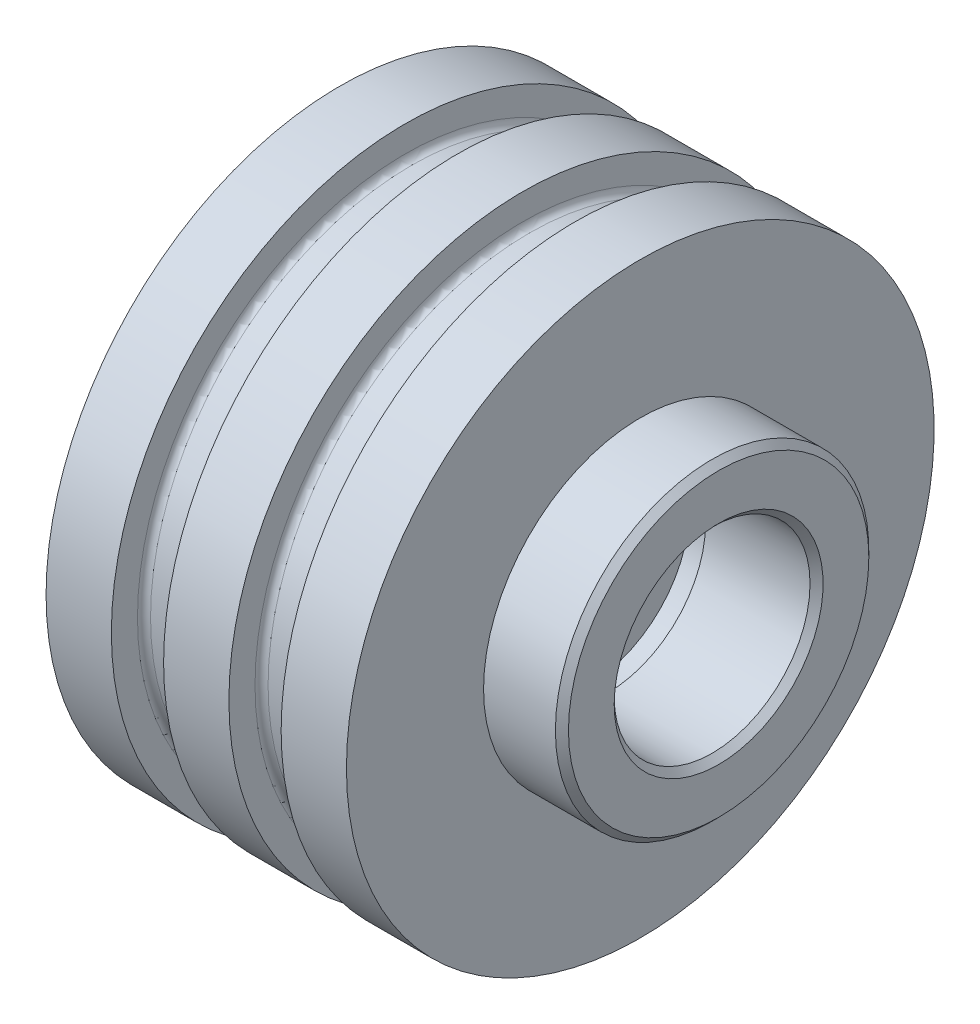
ISO-10303-21;
HEADER;
FILE_DESCRIPTION(('STEP AP214'),'2;1');
FILE_NAME('part.step','',(''),(''),'','','');
FILE_SCHEMA(('AUTOMOTIVE_DESIGN { 1 0 10303 214 1 1 1 1 }'));
ENDSEC;
DATA;
#1=APPLICATION_CONTEXT('core data for automotive mechanical design processes');
#2=APPLICATION_PROTOCOL_DEFINITION('international standard','automotive_design',2000,#1);
#3=PRODUCT_CONTEXT('',#1,'mechanical');
#4=PRODUCT('Part','Part','',(#3));
#5=PRODUCT_RELATED_PRODUCT_CATEGORY('part','',(#4));
#6=PRODUCT_DEFINITION_FORMATION('','',#4);
#7=PRODUCT_DEFINITION_CONTEXT('part definition',#1,'design');
#8=PRODUCT_DEFINITION('design','',#6,#7);
#9=PRODUCT_DEFINITION_SHAPE('','',#8);
#10=(LENGTH_UNIT() NAMED_UNIT(*) SI_UNIT(.MILLI.,.METRE.));
#11=(NAMED_UNIT(*) PLANE_ANGLE_UNIT() SI_UNIT($,.RADIAN.));
#12=(NAMED_UNIT(*) SI_UNIT($,.STERADIAN.) SOLID_ANGLE_UNIT());
#13=UNCERTAINTY_MEASURE_WITH_UNIT(LENGTH_MEASURE(1.E-05),#10,'distance_accuracy_value','');
#14=(GEOMETRIC_REPRESENTATION_CONTEXT(3) GLOBAL_UNCERTAINTY_ASSIGNED_CONTEXT((#13)) GLOBAL_UNIT_ASSIGNED_CONTEXT((#10,
#11,#12)) REPRESENTATION_CONTEXT('',''));
#15=CARTESIAN_POINT('',(0.,0.,0.));
#16=DIRECTION('',(0.,0.,1.));
#17=DIRECTION('',(1.,0.,0.));
#18=AXIS2_PLACEMENT_3D('',#15,#16,#17);
#19=CARTESIAN_POINT('',(28.,45.,0.));
#20=DIRECTION('',(-1.,0.,0.));
#21=DIRECTION('',(0.,0.,1.));
#22=AXIS2_PLACEMENT_3D('',#19,#20,#21);
#23=PLANE('',#22);
#24=CARTESIAN_POINT('',(28.,0.,0.));
#25=DIRECTION('',(-1.,0.,0.));
#26=DIRECTION('',(0.,0.,1.));
#27=AXIS2_PLACEMENT_3D('',#24,#25,#26);
#28=CIRCLE('',#27,45.);
#29=CARTESIAN_POINT('',(28.,0.,45.));
#30=VERTEX_POINT('',#29);
#31=EDGE_CURVE('E43',#30,#30,#28,.T.);
#32=ORIENTED_EDGE('',*,*,#31,.F.);
#33=EDGE_LOOP('',(#32));
#34=FACE_BOUND('',#33,.T.);
#35=CARTESIAN_POINT('',(28.,0.,0.));
#36=DIRECTION('',(-1.,0.,0.));
#37=DIRECTION('',(0.,0.,1.));
#38=AXIS2_PLACEMENT_3D('',#35,#36,#37);
#39=CIRCLE('',#38,41.);
#40=CARTESIAN_POINT('',(28.,0.,41.));
#41=VERTEX_POINT('',#40);
#42=EDGE_CURVE('E100',#41,#41,#39,.T.);
#43=ORIENTED_EDGE('',*,*,#42,.T.);
#44=EDGE_LOOP('',(#43));
#45=FACE_BOUND('',#44,.T.);
#46=ADVANCED_FACE('F32',(#34,#45),#23,.F.);
#47=CARTESIAN_POINT('',(2.00000000000001,0.,0.));
#48=DIRECTION('',(-1.,0.,0.));
#49=DIRECTION('',(0.,0.,1.));
#50=AXIS2_PLACEMENT_3D('',#47,#48,#49);
#51=CYLINDRICAL_SURFACE('',#50,45.);
#52=CARTESIAN_POINT('',(18.,0.,0.));
#53=DIRECTION('',(-1.,0.,0.));
#54=DIRECTION('',(0.,0.,1.));
#55=AXIS2_PLACEMENT_3D('',#52,#53,#54);
#56=CIRCLE('',#55,45.);
#57=CARTESIAN_POINT('',(18.,0.,45.));
#58=VERTEX_POINT('',#57);
#59=EDGE_CURVE('E47',#58,#58,#56,.T.);
#60=ORIENTED_EDGE('',*,*,#59,.F.);
#61=EDGE_LOOP('',(#60));
#62=FACE_BOUND('',#61,.T.);
#63=ORIENTED_EDGE('',*,*,#31,.T.);
#64=EDGE_LOOP('',(#63));
#65=FACE_BOUND('',#64,.T.);
#66=ADVANCED_FACE('F127',(#62,#65),#51,.T.);
#67=CARTESIAN_POINT('',(18.,41.,0.));
#68=DIRECTION('',(1.,0.,0.));
#69=DIRECTION('',(0.,0.,-1.));
#70=AXIS2_PLACEMENT_3D('',#67,#68,#69);
#71=PLANE('',#70);
#72=CARTESIAN_POINT('',(18.,0.,0.));
#73=DIRECTION('',(-1.,0.,0.));
#74=DIRECTION('',(0.,0.,1.));
#75=AXIS2_PLACEMENT_3D('',#72,#73,#74);
#76=CIRCLE('',#75,41.);
#77=CARTESIAN_POINT('',(18.,0.,41.));
#78=VERTEX_POINT('',#77);
#79=EDGE_CURVE('E52',#78,#78,#76,.T.);
#80=ORIENTED_EDGE('',*,*,#79,.F.);
#81=EDGE_LOOP('',(#80));
#82=FACE_BOUND('',#81,.T.);
#83=ORIENTED_EDGE('',*,*,#59,.T.);
#84=EDGE_LOOP('',(#83));
#85=FACE_BOUND('',#84,.T.);
#86=ADVANCED_FACE('F132',(#82,#85),#71,.F.);
#87=CARTESIAN_POINT('',(17.,0.,0.));
#88=DIRECTION('',(-1.,0.,0.));
#89=DIRECTION('',(0.,0.,1.));
#90=AXIS2_PLACEMENT_3D('',#87,#88,#89);
#91=TOROIDAL_SURFACE('',#90,41.,1.);
#92=CARTESIAN_POINT('',(17.,0.,0.));
#93=DIRECTION('',(-1.,0.,0.));
#94=DIRECTION('',(0.,0.,1.));
#95=AXIS2_PLACEMENT_3D('',#92,#93,#94);
#96=CIRCLE('',#95,40.);
#97=CARTESIAN_POINT('',(17.,0.,40.));
#98=VERTEX_POINT('',#97);
#99=EDGE_CURVE('E55',#98,#98,#96,.T.);
#100=ORIENTED_EDGE('',*,*,#99,.F.);
#101=EDGE_LOOP('',(#100));
#102=FACE_BOUND('',#101,.T.);
#103=ORIENTED_EDGE('',*,*,#79,.T.);
#104=EDGE_LOOP('',(#103));
#105=FACE_BOUND('',#104,.T.);
#106=ADVANCED_FACE('F140',(#102,#105),#91,.F.);
#107=CARTESIAN_POINT('',(2.00000000000001,0.,0.));
#108=DIRECTION('',(-1.,0.,0.));
#109=DIRECTION('',(0.,0.,1.));
#110=AXIS2_PLACEMENT_3D('',#107,#108,#109);
#111=CYLINDRICAL_SURFACE('',#110,40.);
#112=CARTESIAN_POINT('',(11.,0.,0.));
#113=DIRECTION('',(-1.,0.,0.));
#114=DIRECTION('',(0.,0.,1.));
#115=AXIS2_PLACEMENT_3D('',#112,#113,#114);
#116=CIRCLE('',#115,40.);
#117=CARTESIAN_POINT('',(11.,0.,40.));
#118=VERTEX_POINT('',#117);
#119=EDGE_CURVE('E58',#118,#118,#116,.T.);
#120=ORIENTED_EDGE('',*,*,#119,.F.);
#121=EDGE_LOOP('',(#120));
#122=FACE_BOUND('',#121,.T.);
#123=ORIENTED_EDGE('',*,*,#99,.T.);
#124=EDGE_LOOP('',(#123));
#125=FACE_BOUND('',#124,.T.);
#126=ADVANCED_FACE('F144',(#122,#125),#111,.T.);
#127=CARTESIAN_POINT('',(11.,0.,0.));
#128=DIRECTION('',(-1.,0.,0.));
#129=DIRECTION('',(0.,0.,1.));
#130=AXIS2_PLACEMENT_3D('',#127,#128,#129);
#131=TOROIDAL_SURFACE('',#130,41.,1.);
#132=CARTESIAN_POINT('',(9.99999999999999,0.,0.));
#133=DIRECTION('',(-1.,0.,0.));
#134=DIRECTION('',(0.,0.,1.));
#135=AXIS2_PLACEMENT_3D('',#132,#133,#134);
#136=CIRCLE('',#135,41.);
#137=CARTESIAN_POINT('',(9.99999999999999,0.,41.));
#138=VERTEX_POINT('',#137);
#139=EDGE_CURVE('E61',#138,#138,#136,.T.);
#140=ORIENTED_EDGE('',*,*,#139,.F.);
#141=EDGE_LOOP('',(#140));
#142=FACE_BOUND('',#141,.T.);
#143=ORIENTED_EDGE('',*,*,#119,.T.);
#144=EDGE_LOOP('',(#143));
#145=FACE_BOUND('',#144,.T.);
#146=ADVANCED_FACE('F148',(#142,#145),#131,.F.);
#147=CARTESIAN_POINT('',(9.99999999999999,45.,0.));
#148=DIRECTION('',(-1.,0.,0.));
#149=DIRECTION('',(0.,0.,1.));
#150=AXIS2_PLACEMENT_3D('',#147,#148,#149);
#151=PLANE('',#150);
#152=CARTESIAN_POINT('',(10.,0.,0.));
#153=DIRECTION('',(-1.,0.,0.));
#154=DIRECTION('',(0.,0.,1.));
#155=AXIS2_PLACEMENT_3D('',#152,#153,#154);
#156=CIRCLE('',#155,45.);
#157=CARTESIAN_POINT('',(10.,0.,45.));
#158=VERTEX_POINT('',#157);
#159=EDGE_CURVE('E64',#158,#158,#156,.T.);
#160=ORIENTED_EDGE('',*,*,#159,.F.);
#161=EDGE_LOOP('',(#160));
#162=FACE_BOUND('',#161,.T.);
#163=ORIENTED_EDGE('',*,*,#139,.T.);
#164=EDGE_LOOP('',(#163));
#165=FACE_BOUND('',#164,.T.);
#166=ADVANCED_FACE('F152',(#162,#165),#151,.F.);
#167=CARTESIAN_POINT('',(2.00000000000001,0.,0.));
#168=DIRECTION('',(-1.,0.,0.));
#169=DIRECTION('',(0.,0.,1.));
#170=AXIS2_PLACEMENT_3D('',#167,#168,#169);
#171=CYLINDRICAL_SURFACE('',#170,45.);
#172=CARTESIAN_POINT('',(0.,0.,0.));
#173=DIRECTION('',(-1.,0.,0.));
#174=DIRECTION('',(0.,0.,1.));
#175=AXIS2_PLACEMENT_3D('',#172,#173,#174);
#176=CIRCLE('',#175,45.);
#177=CARTESIAN_POINT('',(0.,0.,45.));
#178=VERTEX_POINT('',#177);
#179=EDGE_CURVE('E67',#178,#178,#176,.T.);
#180=ORIENTED_EDGE('',*,*,#179,.F.);
#181=EDGE_LOOP('',(#180));
#182=FACE_BOUND('',#181,.T.);
#183=ORIENTED_EDGE('',*,*,#159,.T.);
#184=EDGE_LOOP('',(#183));
#185=FACE_BOUND('',#184,.T.);
#186=ADVANCED_FACE('F156',(#182,#185),#171,.T.);
#187=CARTESIAN_POINT('',(0.,42.,0.));
#188=DIRECTION('',(1.,0.,0.));
#189=DIRECTION('',(0.,0.,-1.));
#190=AXIS2_PLACEMENT_3D('',#187,#188,#189);
#191=PLANE('',#190);
#192=CARTESIAN_POINT('',(0.,0.,0.));
#193=DIRECTION('',(-1.,0.,0.));
#194=DIRECTION('',(0.,0.,1.));
#195=AXIS2_PLACEMENT_3D('',#192,#193,#194);
#196=CIRCLE('',#195,42.);
#197=CARTESIAN_POINT('',(0.,0.,42.));
#198=VERTEX_POINT('',#197);
#199=EDGE_CURVE('E70',#198,#198,#196,.T.);
#200=ORIENTED_EDGE('',*,*,#199,.F.);
#201=EDGE_LOOP('',(#200));
#202=FACE_BOUND('',#201,.T.);
#203=ORIENTED_EDGE('',*,*,#179,.T.);
#204=EDGE_LOOP('',(#203));
#205=FACE_BOUND('',#204,.T.);
#206=ADVANCED_FACE('F160',(#202,#205),#191,.F.);
#207=CARTESIAN_POINT('',(2.00000000000001,0.,0.));
#208=DIRECTION('',(-1.,0.,0.));
#209=DIRECTION('',(0.,0.,1.));
#210=AXIS2_PLACEMENT_3D('',#207,#208,#209);
#211=CYLINDRICAL_SURFACE('',#210,42.);
#212=CARTESIAN_POINT('',(1.99999999999999,0.,0.));
#213=DIRECTION('',(-1.,0.,0.));
#214=DIRECTION('',(0.,0.,1.));
#215=AXIS2_PLACEMENT_3D('',#212,#213,#214);
#216=CIRCLE('',#215,42.);
#217=CARTESIAN_POINT('',(1.99999999999999,0.,42.));
#218=VERTEX_POINT('',#217);
#219=EDGE_CURVE('E73',#218,#218,#216,.T.);
#220=ORIENTED_EDGE('',*,*,#219,.F.);
#221=EDGE_LOOP('',(#220));
#222=FACE_BOUND('',#221,.T.);
#223=ORIENTED_EDGE('',*,*,#199,.T.);
#224=EDGE_LOOP('',(#223));
#225=FACE_BOUND('',#224,.T.);
#226=ADVANCED_FACE('F164',(#222,#225),#211,.F.);
#227=CARTESIAN_POINT('',(2.,42.,0.));
#228=DIRECTION('',(1.,0.,0.));
#229=DIRECTION('',(0.,0.,-1.));
#230=AXIS2_PLACEMENT_3D('',#227,#228,#229);
#231=PLANE('',#230);
#232=ORIENTED_EDGE('',*,*,#219,.T.);
#233=EDGE_LOOP('',(#232));
#234=FACE_BOUND('',#233,.T.);
#235=ADVANCED_FACE('F168',(#234),#231,.F.);
#236=CARTESIAN_POINT('',(58.,23.,0.));
#237=DIRECTION('',(-1.,0.,0.));
#238=DIRECTION('',(0.,0.,1.));
#239=AXIS2_PLACEMENT_3D('',#236,#237,#238);
#240=PLANE('',#239);
#241=CARTESIAN_POINT('',(58.,0.,0.));
#242=DIRECTION('',(-1.,0.,0.));
#243=DIRECTION('',(0.,0.,1.));
#244=AXIS2_PLACEMENT_3D('',#241,#242,#243);
#245=CIRCLE('',#244,16.);
#246=CARTESIAN_POINT('',(58.,0.,16.));
#247=VERTEX_POINT('',#246);
#248=EDGE_CURVE('E39',#247,#247,#245,.T.);
#249=ORIENTED_EDGE('',*,*,#248,.T.);
#250=EDGE_LOOP('',(#249));
#251=FACE_BOUND('',#250,.T.);
#252=CARTESIAN_POINT('',(58.,0.,0.));
#253=DIRECTION('',(-1.,0.,0.));
#254=DIRECTION('',(0.,0.,1.));
#255=AXIS2_PLACEMENT_3D('',#252,#253,#254);
#256=CIRCLE('',#255,23.);
#257=CARTESIAN_POINT('',(58.,0.,23.));
#258=VERTEX_POINT('',#257);
#259=EDGE_CURVE('E76',#258,#258,#256,.T.);
#260=ORIENTED_EDGE('',*,*,#259,.F.);
#261=EDGE_LOOP('',(#260));
#262=FACE_BOUND('',#261,.T.);
#263=ADVANCED_FACE('F172',(#251,#262),#240,.F.);
#264=CARTESIAN_POINT('',(58.,0.,0.));
#265=DIRECTION('',(-1.,0.,0.));
#266=DIRECTION('',(0.,0.,1.));
#267=AXIS2_PLACEMENT_3D('',#264,#265,#266);
#268=CONICAL_SURFACE('',#267,23.,0.785398163397452);
#269=CARTESIAN_POINT('',(57.,0.,0.));
#270=DIRECTION('',(-1.,0.,0.));
#271=DIRECTION('',(0.,0.,1.));
#272=AXIS2_PLACEMENT_3D('',#269,#270,#271);
#273=CIRCLE('',#272,24.);
#274=CARTESIAN_POINT('',(57.,0.,24.));
#275=VERTEX_POINT('',#274);
#276=EDGE_CURVE('E79',#275,#275,#273,.T.);
#277=ORIENTED_EDGE('',*,*,#276,.F.);
#278=EDGE_LOOP('',(#277));
#279=FACE_BOUND('',#278,.T.);
#280=ORIENTED_EDGE('',*,*,#259,.T.);
#281=EDGE_LOOP('',(#280));
#282=FACE_BOUND('',#281,.T.);
#283=ADVANCED_FACE('F176',(#279,#282),#268,.T.);
#284=CARTESIAN_POINT('',(2.00000000000001,0.,0.));
#285=DIRECTION('',(-1.,0.,0.));
#286=DIRECTION('',(0.,0.,1.));
#287=AXIS2_PLACEMENT_3D('',#284,#285,#286);
#288=CYLINDRICAL_SURFACE('',#287,24.);
#289=CARTESIAN_POINT('',(46.,0.,0.));
#290=DIRECTION('',(-1.,0.,0.));
#291=DIRECTION('',(0.,0.,1.));
#292=AXIS2_PLACEMENT_3D('',#289,#290,#291);
#293=CIRCLE('',#292,24.);
#294=CARTESIAN_POINT('',(46.,0.,24.));
#295=VERTEX_POINT('',#294);
#296=EDGE_CURVE('E82',#295,#295,#293,.T.);
#297=ORIENTED_EDGE('',*,*,#296,.F.);
#298=EDGE_LOOP('',(#297));
#299=FACE_BOUND('',#298,.T.);
#300=ORIENTED_EDGE('',*,*,#276,.T.);
#301=EDGE_LOOP('',(#300));
#302=FACE_BOUND('',#301,.T.);
#303=ADVANCED_FACE('F179',(#299,#302),#288,.T.);
#304=CARTESIAN_POINT('',(46.,45.,0.));
#305=DIRECTION('',(-1.,0.,0.));
#306=DIRECTION('',(0.,0.,1.));
#307=AXIS2_PLACEMENT_3D('',#304,#305,#306);
#308=PLANE('',#307);
#309=CARTESIAN_POINT('',(46.,0.,0.));
#310=DIRECTION('',(-1.,0.,0.));
#311=DIRECTION('',(0.,0.,1.));
#312=AXIS2_PLACEMENT_3D('',#309,#310,#311);
#313=CIRCLE('',#312,45.);
#314=CARTESIAN_POINT('',(46.,0.,45.));
#315=VERTEX_POINT('',#314);
#316=EDGE_CURVE('E85',#315,#315,#313,.T.);
#317=ORIENTED_EDGE('',*,*,#316,.F.);
#318=EDGE_LOOP('',(#317));
#319=FACE_BOUND('',#318,.T.);
#320=ORIENTED_EDGE('',*,*,#296,.T.);
#321=EDGE_LOOP('',(#320));
#322=FACE_BOUND('',#321,.T.);
#323=ADVANCED_FACE('F183',(#319,#322),#308,.F.);
#324=CARTESIAN_POINT('',(2.00000000000001,0.,0.));
#325=DIRECTION('',(-1.,0.,0.));
#326=DIRECTION('',(0.,0.,1.));
#327=AXIS2_PLACEMENT_3D('',#324,#325,#326);
#328=CYLINDRICAL_SURFACE('',#327,45.);
#329=CARTESIAN_POINT('',(36.,0.,0.));
#330=DIRECTION('',(-1.,0.,0.));
#331=DIRECTION('',(0.,0.,1.));
#332=AXIS2_PLACEMENT_3D('',#329,#330,#331);
#333=CIRCLE('',#332,45.);
#334=CARTESIAN_POINT('',(36.,0.,45.));
#335=VERTEX_POINT('',#334);
#336=EDGE_CURVE('E88',#335,#335,#333,.T.);
#337=ORIENTED_EDGE('',*,*,#336,.F.);
#338=EDGE_LOOP('',(#337));
#339=FACE_BOUND('',#338,.T.);
#340=ORIENTED_EDGE('',*,*,#316,.T.);
#341=EDGE_LOOP('',(#340));
#342=FACE_BOUND('',#341,.T.);
#343=ADVANCED_FACE('F187',(#339,#342),#328,.T.);
#344=CARTESIAN_POINT('',(36.,41.,0.));
#345=DIRECTION('',(1.,0.,0.));
#346=DIRECTION('',(0.,0.,-1.));
#347=AXIS2_PLACEMENT_3D('',#344,#345,#346);
#348=PLANE('',#347);
#349=CARTESIAN_POINT('',(36.,0.,0.));
#350=DIRECTION('',(-1.,0.,0.));
#351=DIRECTION('',(0.,0.,1.));
#352=AXIS2_PLACEMENT_3D('',#349,#350,#351);
#353=CIRCLE('',#352,41.);
#354=CARTESIAN_POINT('',(36.,0.,41.));
#355=VERTEX_POINT('',#354);
#356=EDGE_CURVE('E91',#355,#355,#353,.T.);
#357=ORIENTED_EDGE('',*,*,#356,.F.);
#358=EDGE_LOOP('',(#357));
#359=FACE_BOUND('',#358,.T.);
#360=ORIENTED_EDGE('',*,*,#336,.T.);
#361=EDGE_LOOP('',(#360));
#362=FACE_BOUND('',#361,.T.);
#363=ADVANCED_FACE('F191',(#359,#362),#348,.F.);
#364=CARTESIAN_POINT('',(35.,0.,0.));
#365=DIRECTION('',(-1.,0.,0.));
#366=DIRECTION('',(0.,0.,1.));
#367=AXIS2_PLACEMENT_3D('',#364,#365,#366);
#368=TOROIDAL_SURFACE('',#367,41.,1.);
#369=CARTESIAN_POINT('',(35.,0.,0.));
#370=DIRECTION('',(-1.,0.,0.));
#371=DIRECTION('',(0.,0.,1.));
#372=AXIS2_PLACEMENT_3D('',#369,#370,#371);
#373=CIRCLE('',#372,40.);
#374=CARTESIAN_POINT('',(35.,0.,40.));
#375=VERTEX_POINT('',#374);
#376=EDGE_CURVE('E94',#375,#375,#373,.T.);
#377=ORIENTED_EDGE('',*,*,#376,.F.);
#378=EDGE_LOOP('',(#377));
#379=FACE_BOUND('',#378,.T.);
#380=ORIENTED_EDGE('',*,*,#356,.T.);
#381=EDGE_LOOP('',(#380));
#382=FACE_BOUND('',#381,.T.);
#383=ADVANCED_FACE('F195',(#379,#382),#368,.F.);
#384=CARTESIAN_POINT('',(2.00000000000001,0.,0.));
#385=DIRECTION('',(-1.,0.,0.));
#386=DIRECTION('',(0.,0.,1.));
#387=AXIS2_PLACEMENT_3D('',#384,#385,#386);
#388=CYLINDRICAL_SURFACE('',#387,40.);
#389=CARTESIAN_POINT('',(29.,0.,0.));
#390=DIRECTION('',(-1.,0.,0.));
#391=DIRECTION('',(0.,0.,1.));
#392=AXIS2_PLACEMENT_3D('',#389,#390,#391);
#393=CIRCLE('',#392,40.);
#394=CARTESIAN_POINT('',(29.,0.,40.));
#395=VERTEX_POINT('',#394);
#396=EDGE_CURVE('E97',#395,#395,#393,.T.);
#397=ORIENTED_EDGE('',*,*,#396,.F.);
#398=EDGE_LOOP('',(#397));
#399=FACE_BOUND('',#398,.T.);
#400=ORIENTED_EDGE('',*,*,#376,.T.);
#401=EDGE_LOOP('',(#400));
#402=FACE_BOUND('',#401,.T.);
#403=ADVANCED_FACE('F199',(#399,#402),#388,.T.);
#404=CARTESIAN_POINT('',(29.,0.,0.));
#405=DIRECTION('',(-1.,0.,0.));
#406=DIRECTION('',(0.,0.,1.));
#407=AXIS2_PLACEMENT_3D('',#404,#405,#406);
#408=TOROIDAL_SURFACE('',#407,41.,1.);
#409=ORIENTED_EDGE('',*,*,#42,.F.);
#410=EDGE_LOOP('',(#409));
#411=FACE_BOUND('',#410,.T.);
#412=ORIENTED_EDGE('',*,*,#396,.T.);
#413=EDGE_LOOP('',(#412));
#414=FACE_BOUND('',#413,.T.);
#415=ADVANCED_FACE('F203',(#411,#414),#408,.F.);
#416=CARTESIAN_POINT('',(0.,0.,0.));
#417=DIRECTION('',(-1.,0.,0.));
#418=DIRECTION('',(0.,0.,1.));
#419=AXIS2_PLACEMENT_3D('',#416,#417,#418);
#420=CYLINDRICAL_SURFACE('',#419,15.);
#421=CARTESIAN_POINT('',(57.,0.,0.));
#422=DIRECTION('',(-1.,0.,0.));
#423=DIRECTION('',(0.,0.,1.));
#424=AXIS2_PLACEMENT_3D('',#421,#422,#423);
#425=CIRCLE('',#424,15.);
#426=CARTESIAN_POINT('',(57.,0.,15.));
#427=VERTEX_POINT('',#426);
#428=EDGE_CURVE('E10',#427,#427,#425,.F.);
#429=ORIENTED_EDGE('',*,*,#428,.T.);
#430=EDGE_LOOP('',(#429));
#431=FACE_BOUND('',#430,.T.);
#432=CARTESIAN_POINT('',(41.,0.,0.));
#433=DIRECTION('',(-1.,0.,0.));
#434=DIRECTION('',(0.,0.,1.));
#435=AXIS2_PLACEMENT_3D('',#432,#433,#434);
#436=CIRCLE('',#435,15.);
#437=CARTESIAN_POINT('',(41.,0.,15.));
#438=VERTEX_POINT('',#437);
#439=EDGE_CURVE('E103',#438,#438,#436,.T.);
#440=ORIENTED_EDGE('',*,*,#439,.T.);
#441=EDGE_LOOP('',(#440));
#442=FACE_BOUND('',#441,.T.);
#443=ADVANCED_FACE('F207',(#431,#442),#420,.F.);
#444=CARTESIAN_POINT('',(41.,15.,0.));
#445=DIRECTION('',(-1.,0.,0.));
#446=DIRECTION('',(0.,0.,1.));
#447=AXIS2_PLACEMENT_3D('',#444,#445,#446);
#448=PLANE('',#447);
#449=CARTESIAN_POINT('',(41.,0.,0.));
#450=DIRECTION('',(-1.,0.,0.));
#451=DIRECTION('',(0.,0.,1.));
#452=AXIS2_PLACEMENT_3D('',#449,#450,#451);
#453=CIRCLE('',#452,15.5);
#454=CARTESIAN_POINT('',(41.,0.,15.5));
#455=VERTEX_POINT('',#454);
#456=EDGE_CURVE('E106',#455,#455,#453,.T.);
#457=ORIENTED_EDGE('',*,*,#456,.T.);
#458=EDGE_LOOP('',(#457));
#459=FACE_BOUND('',#458,.T.);
#460=ORIENTED_EDGE('',*,*,#439,.F.);
#461=EDGE_LOOP('',(#460));
#462=FACE_BOUND('',#461,.T.);
#463=ADVANCED_FACE('F124',(#459,#462),#448,.T.);
#464=CARTESIAN_POINT('',(0.,0.,0.));
#465=DIRECTION('',(-1.,0.,0.));
#466=DIRECTION('',(0.,0.,1.));
#467=AXIS2_PLACEMENT_3D('',#464,#465,#466);
#468=CYLINDRICAL_SURFACE('',#467,15.5);
#469=CARTESIAN_POINT('',(38.,0.,0.));
#470=DIRECTION('',(-1.,0.,0.));
#471=DIRECTION('',(0.,0.,1.));
#472=AXIS2_PLACEMENT_3D('',#469,#470,#471);
#473=CIRCLE('',#472,15.5);
#474=CARTESIAN_POINT('',(38.,0.,15.5));
#475=VERTEX_POINT('',#474);
#476=EDGE_CURVE('E109',#475,#475,#473,.T.);
#477=ORIENTED_EDGE('',*,*,#476,.T.);
#478=EDGE_LOOP('',(#477));
#479=FACE_BOUND('',#478,.T.);
#480=ORIENTED_EDGE('',*,*,#456,.F.);
#481=EDGE_LOOP('',(#480));
#482=FACE_BOUND('',#481,.T.);
#483=ADVANCED_FACE('F113',(#479,#482),#468,.F.);
#484=CARTESIAN_POINT('',(38.,15.5,0.));
#485=DIRECTION('',(1.,0.,0.));
#486=DIRECTION('',(0.,0.,-1.));
#487=AXIS2_PLACEMENT_3D('',#484,#485,#486);
#488=PLANE('',#487);
#489=ORIENTED_EDGE('',*,*,#476,.F.);
#490=EDGE_LOOP('',(#489));
#491=FACE_BOUND('',#490,.T.);
#492=ADVANCED_FACE('F116',(#491),#488,.T.);
#493=CARTESIAN_POINT('',(58.,0.,0.));
#494=DIRECTION('',(1.,0.,0.));
#495=DIRECTION('',(0.,0.,-1.));
#496=AXIS2_PLACEMENT_3D('',#493,#494,#495);
#497=CONICAL_SURFACE('',#496,16.,0.785398163397448);
#498=ORIENTED_EDGE('',*,*,#428,.F.);
#499=EDGE_LOOP('',(#498));
#500=FACE_BOUND('',#499,.T.);
#501=ORIENTED_EDGE('',*,*,#248,.F.);
#502=EDGE_LOOP('',(#501));
#503=FACE_BOUND('',#502,.T.);
#504=ADVANCED_FACE('F34',(#500,#503),#497,.F.);
#505=CLOSED_SHELL('',(#46,#66,#86,#106,#126,#146,#166,#186,#206,#226,#235,#263,#283,#303,#323,
#343,#363,#383,#403,#415,#443,#463,#483,#492,#504));
#506=MANIFOLD_SOLID_BREP('B2',#505);
#507=ADVANCED_BREP_SHAPE_REPRESENTATION('',(#18,#506),#14);
#508=SHAPE_DEFINITION_REPRESENTATION(#9,#507);
ENDSEC;
END-ISO-10303-21;
